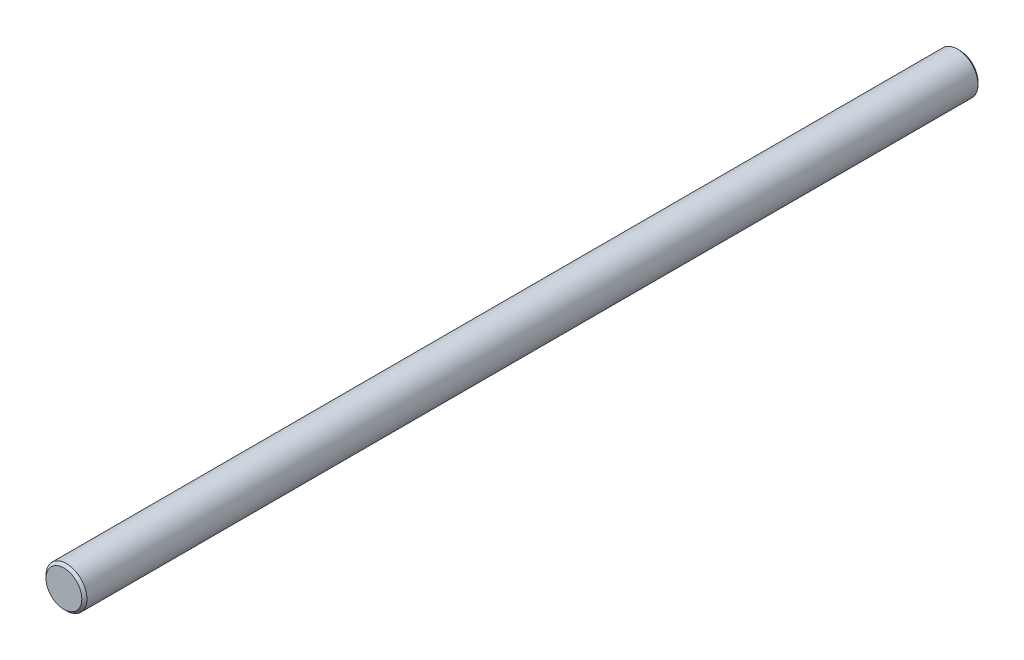
ISO-10303-21;
HEADER;
FILE_DESCRIPTION(('STEP AP214'),'2;1');
FILE_NAME('part.step','',(''),(''),'','','');
FILE_SCHEMA(('AUTOMOTIVE_DESIGN { 1 0 10303 214 1 1 1 1 }'));
ENDSEC;
DATA;
#1=APPLICATION_CONTEXT('core data for automotive mechanical design processes');
#2=APPLICATION_PROTOCOL_DEFINITION('international standard','automotive_design',2000,#1);
#3=PRODUCT_CONTEXT('',#1,'mechanical');
#4=PRODUCT('Part','Part','',(#3));
#5=PRODUCT_RELATED_PRODUCT_CATEGORY('part','',(#4));
#6=PRODUCT_DEFINITION_FORMATION('','',#4);
#7=PRODUCT_DEFINITION_CONTEXT('part definition',#1,'design');
#8=PRODUCT_DEFINITION('design','',#6,#7);
#9=PRODUCT_DEFINITION_SHAPE('','',#8);
#10=(LENGTH_UNIT() NAMED_UNIT(*) SI_UNIT(.MILLI.,.METRE.));
#11=(NAMED_UNIT(*) PLANE_ANGLE_UNIT() SI_UNIT($,.RADIAN.));
#12=(NAMED_UNIT(*) SI_UNIT($,.STERADIAN.) SOLID_ANGLE_UNIT());
#13=UNCERTAINTY_MEASURE_WITH_UNIT(LENGTH_MEASURE(1.E-05),#10,'distance_accuracy_value','');
#14=(GEOMETRIC_REPRESENTATION_CONTEXT(3) GLOBAL_UNCERTAINTY_ASSIGNED_CONTEXT((#13)) GLOBAL_UNIT_ASSIGNED_CONTEXT((#10,
#11,#12)) REPRESENTATION_CONTEXT('',''));
#15=CARTESIAN_POINT('',(0.,0.,0.));
#16=DIRECTION('',(0.,0.,1.));
#17=DIRECTION('',(1.,0.,0.));
#18=AXIS2_PLACEMENT_3D('',#15,#16,#17);
#19=CARTESIAN_POINT('',(0.,0.,175.));
#20=DIRECTION('',(0.,0.,1.));
#21=DIRECTION('',(1.,0.,0.));
#22=AXIS2_PLACEMENT_3D('',#19,#20,#21);
#23=PLANE('',#22);
#24=CARTESIAN_POINT('',(0.,0.,175.));
#25=DIRECTION('',(0.,0.,-1.));
#26=DIRECTION('',(-1.,0.,0.));
#27=AXIS2_PLACEMENT_3D('',#24,#25,#26);
#28=CIRCLE('',#27,3.5);
#29=CARTESIAN_POINT('',(3.5,0.,175.));
#30=VERTEX_POINT('',#29);
#31=EDGE_CURVE('E27',#30,#30,#28,.T.);
#32=ORIENTED_EDGE('',*,*,#31,.F.);
#33=EDGE_LOOP('',(#32));
#34=FACE_BOUND('',#33,.T.);
#35=ADVANCED_FACE('F17',(#34),#23,.T.);
#36=CARTESIAN_POINT('',(0.,0.,174.75));
#37=DIRECTION('',(0.,0.,-1.));
#38=DIRECTION('',(-1.,0.,0.));
#39=AXIS2_PLACEMENT_3D('',#36,#37,#38);
#40=CONICAL_SURFACE('',#39,3.75,0.785398163397441);
#41=ORIENTED_EDGE('',*,*,#31,.T.);
#42=DIRECTION('',(0.707106781186542,0.,-0.707106781186553));
#43=VECTOR('',#42,1.);
#44=CARTESIAN_POINT('',(3.75,0.,174.75));
#45=LINE('',#44,#43);
#46=CARTESIAN_POINT('',(4.,0.,174.5));
#47=VERTEX_POINT('',#46);
#48=EDGE_CURVE('E11',#30,#47,#45,.T.);
#49=ORIENTED_EDGE('',*,*,#48,.T.);
#50=CARTESIAN_POINT('',(0.,0.,174.5));
#51=DIRECTION('',(0.,0.,1.));
#52=DIRECTION('',(-1.,0.,0.));
#53=AXIS2_PLACEMENT_3D('',#50,#51,#52);
#54=CIRCLE('',#53,4.);
#55=EDGE_CURVE('E20',#47,#47,#54,.T.);
#56=ORIENTED_EDGE('',*,*,#55,.T.);
#57=ORIENTED_EDGE('',*,*,#48,.F.);
#58=EDGE_LOOP('',(#41,#49,#56,#57));
#59=FACE_BOUND('',#58,.T.);
#60=ADVANCED_FACE('F79',(#59),#40,.T.);
#61=CARTESIAN_POINT('',(0.,0.,0.));
#62=DIRECTION('',(0.,0.,1.));
#63=DIRECTION('',(1.,0.,0.));
#64=AXIS2_PLACEMENT_3D('',#61,#62,#63);
#65=PLANE('',#64);
#66=CARTESIAN_POINT('',(0.,0.,0.));
#67=DIRECTION('',(0.,0.,1.));
#68=DIRECTION('',(-1.,0.,0.));
#69=AXIS2_PLACEMENT_3D('',#66,#67,#68);
#70=CIRCLE('',#69,3.5);
#71=CARTESIAN_POINT('',(3.5,0.,0.));
#72=VERTEX_POINT('',#71);
#73=EDGE_CURVE('E71',#72,#72,#70,.T.);
#74=ORIENTED_EDGE('',*,*,#73,.F.);
#75=EDGE_LOOP('',(#74));
#76=FACE_BOUND('',#75,.T.);
#77=ADVANCED_FACE('F86',(#76),#65,.F.);
#78=CARTESIAN_POINT('',(0.,0.,0.));
#79=DIRECTION('',(0.,0.,1.));
#80=DIRECTION('',(-1.,0.,0.));
#81=AXIS2_PLACEMENT_3D('',#78,#79,#80);
#82=CYLINDRICAL_SURFACE('',#81,4.);
#83=ORIENTED_EDGE('',*,*,#55,.F.);
#84=DIRECTION('',(0.,0.,-1.));
#85=VECTOR('',#84,1.);
#86=CARTESIAN_POINT('',(4.,0.,0.));
#87=LINE('',#86,#85);
#88=CARTESIAN_POINT('',(4.,0.,0.5));
#89=VERTEX_POINT('',#88);
#90=EDGE_CURVE('E58',#47,#89,#87,.T.);
#91=ORIENTED_EDGE('',*,*,#90,.T.);
#92=CARTESIAN_POINT('',(0.,0.,0.5));
#93=DIRECTION('',(0.,0.,-1.));
#94=DIRECTION('',(-1.,0.,0.));
#95=AXIS2_PLACEMENT_3D('',#92,#93,#94);
#96=CIRCLE('',#95,4.);
#97=EDGE_CURVE('E60',#89,#89,#96,.T.);
#98=ORIENTED_EDGE('',*,*,#97,.F.);
#99=ORIENTED_EDGE('',*,*,#90,.F.);
#100=EDGE_LOOP('',(#83,#91,#98,#99));
#101=FACE_BOUND('',#100,.T.);
#102=ADVANCED_FACE('F59',(#101),#82,.T.);
#103=CARTESIAN_POINT('',(0.,0.,0.25));
#104=DIRECTION('',(0.,0.,1.));
#105=DIRECTION('',(-1.,0.,0.));
#106=AXIS2_PLACEMENT_3D('',#103,#104,#105);
#107=CONICAL_SURFACE('',#106,3.75,0.785398163397448);
#108=ORIENTED_EDGE('',*,*,#73,.T.);
#109=DIRECTION('',(0.707106781186547,0.,0.707106781186548));
#110=VECTOR('',#109,1.);
#111=CARTESIAN_POINT('',(3.75,0.,0.25));
#112=LINE('',#111,#110);
#113=EDGE_CURVE('E50',#72,#89,#112,.T.);
#114=ORIENTED_EDGE('',*,*,#113,.T.);
#115=ORIENTED_EDGE('',*,*,#97,.T.);
#116=ORIENTED_EDGE('',*,*,#113,.F.);
#117=EDGE_LOOP('',(#108,#114,#115,#116));
#118=FACE_BOUND('',#117,.T.);
#119=ADVANCED_FACE('F63',(#118),#107,.T.);
#120=CLOSED_SHELL('',(#35,#60,#77,#102,#119));
#121=MANIFOLD_SOLID_BREP('B1',#120);
#122=ADVANCED_BREP_SHAPE_REPRESENTATION('',(#18,#121),#14);
#123=SHAPE_DEFINITION_REPRESENTATION(#9,#122);
ENDSEC;
END-ISO-10303-21;
